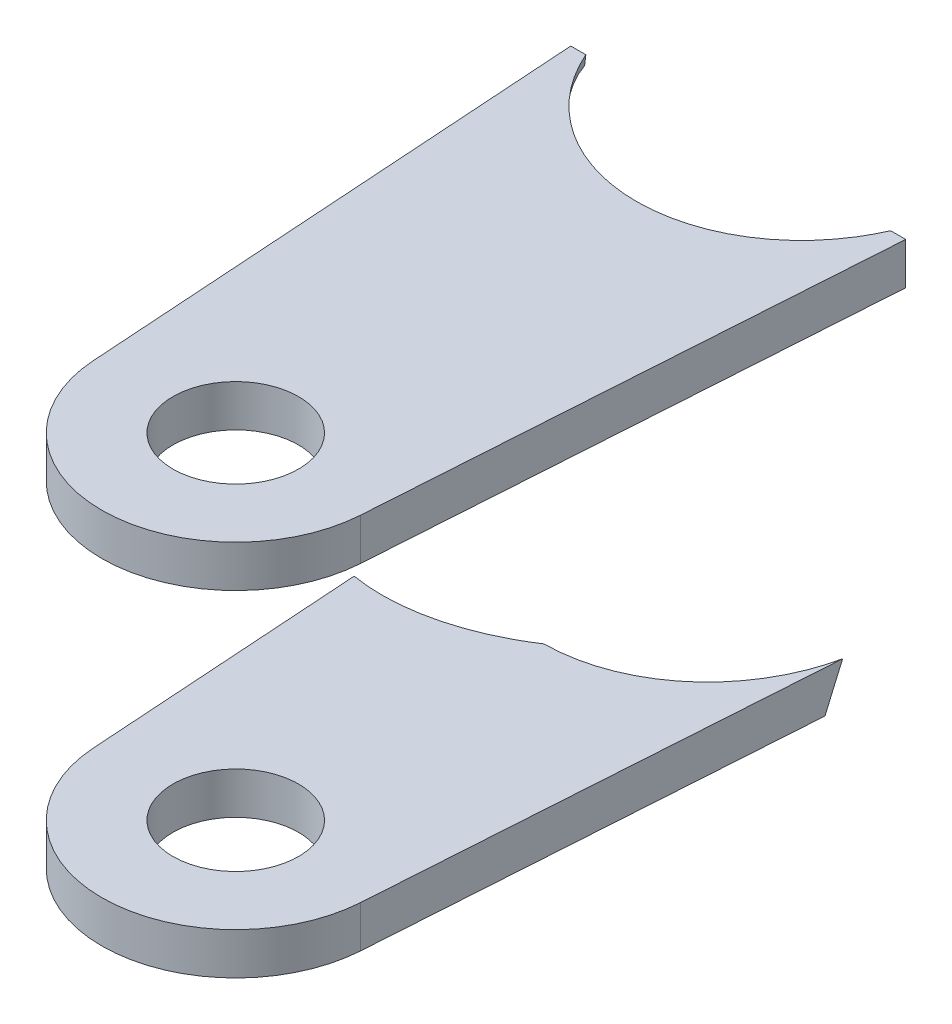
ISO-10303-21;
HEADER;
FILE_DESCRIPTION(('STEP AP214'),'2;1');
FILE_NAME('part.step','',(''),(''),'','','');
FILE_SCHEMA(('AUTOMOTIVE_DESIGN { 1 0 10303 214 1 1 1 1 }'));
ENDSEC;
DATA;
#1=APPLICATION_CONTEXT('core data for automotive mechanical design processes');
#2=APPLICATION_PROTOCOL_DEFINITION('international standard','automotive_design',2000,#1);
#3=PRODUCT_CONTEXT('',#1,'mechanical');
#4=PRODUCT('Part','Part','',(#3));
#5=PRODUCT_RELATED_PRODUCT_CATEGORY('part','',(#4));
#6=PRODUCT_DEFINITION_FORMATION('','',#4);
#7=PRODUCT_DEFINITION_CONTEXT('part definition',#1,'design');
#8=PRODUCT_DEFINITION('design','',#6,#7);
#9=PRODUCT_DEFINITION_SHAPE('','',#8);
#10=(LENGTH_UNIT() NAMED_UNIT(*) SI_UNIT(.MILLI.,.METRE.));
#11=(NAMED_UNIT(*) PLANE_ANGLE_UNIT() SI_UNIT($,.RADIAN.));
#12=(NAMED_UNIT(*) SI_UNIT($,.STERADIAN.) SOLID_ANGLE_UNIT());
#13=UNCERTAINTY_MEASURE_WITH_UNIT(LENGTH_MEASURE(1.E-05),#10,'distance_accuracy_value','');
#14=(GEOMETRIC_REPRESENTATION_CONTEXT(3) GLOBAL_UNCERTAINTY_ASSIGNED_CONTEXT((#13)) GLOBAL_UNIT_ASSIGNED_CONTEXT((#10,
#11,#12)) REPRESENTATION_CONTEXT('',''));
#15=CARTESIAN_POINT('',(0.,0.,0.));
#16=DIRECTION('',(0.,0.,1.));
#17=DIRECTION('',(1.,0.,0.));
#18=AXIS2_PLACEMENT_3D('',#15,#16,#17);
#19=CARTESIAN_POINT('',(0.,-11.13155,0.));
#20=DIRECTION('',(0.,1.,0.));
#21=DIRECTION('',(0.,0.,1.));
#22=AXIS2_PLACEMENT_3D('',#19,#20,#21);
#23=PLANE('',#22);
#24=CARTESIAN_POINT('',(0.,-11.13155,0.));
#25=DIRECTION('',(0.,1.,0.));
#26=DIRECTION('',(0.,0.,1.));
#27=AXIS2_PLACEMENT_3D('',#24,#25,#26);
#28=CIRCLE('',#27,4.7625);
#29=CARTESIAN_POINT('',(0.,-11.13155,4.7625));
#30=VERTEX_POINT('',#29);
#31=EDGE_CURVE('E219',#30,#30,#28,.T.);
#32=ORIENTED_EDGE('',*,*,#31,.F.);
#33=EDGE_LOOP('',(#32));
#34=FACE_BOUND('',#33,.T.);
#35=DIRECTION('',(0.065941170815567,0.,-0.997823512446701));
#36=VECTOR('',#35,1.);
#37=CARTESIAN_POINT('',(10.1378868864585,-11.13155,0.669962295486161));
#38=LINE('',#37,#36);
#39=CARTESIAN_POINT('',(10.1378868864585,-11.13155,0.669962295486162));
#40=VERTEX_POINT('',#39);
#41=CARTESIAN_POINT('',(12.40370088307,-11.13155,-33.6163940534678));
#42=VERTEX_POINT('',#41);
#43=EDGE_CURVE('E214',#40,#42,#38,.T.);
#44=ORIENTED_EDGE('',*,*,#43,.T.);
#45=CARTESIAN_POINT('',(6.83233166149712E-13,-11.13155,-36.4485542746041));
#46=DIRECTION('',(0.,1.,0.));
#47=DIRECTION('',(0.,0.,-1.));
#48=AXIS2_PLACEMENT_3D('',#45,#46,#47);
#49=ELLIPSE('',#48,13.1882595385154,12.7);
#50=CARTESIAN_POINT('',(0.101055690574163,-11.1315499999997,-23.2607122572307));
#51=VERTEX_POINT('',#50);
#52=EDGE_CURVE('E150',#42,#51,#49,.F.);
#53=ORIENTED_EDGE('',*,*,#52,.T.);
#54=CARTESIAN_POINT('',(-6.23102791069439,-11.13155,-34.3499865807654));
#55=DIRECTION('',(0.,1.,0.));
#56=DIRECTION('',(-0.766871698259869,0.,0.641800435032593));
#57=AXIS2_PLACEMENT_3D('',#54,#55,#56);
#58=ELLIPSE('',#57,15.7233905378156,12.7);
#59=CARTESIAN_POINT('',(-11.5378820796358,-11.13155,-20.5148013929212));
#60=VERTEX_POINT('',#59);
#61=EDGE_CURVE('E224',#51,#60,#58,.F.);
#62=ORIENTED_EDGE('',*,*,#61,.T.);
#63=DIRECTION('',(-0.065941170815567,0.,-0.997823512446701));
#64=VECTOR('',#63,1.);
#65=CARTESIAN_POINT('',(-10.1378868864585,-11.13155,0.669962295486161));
#66=LINE('',#65,#64);
#67=CARTESIAN_POINT('',(-10.1378868864585,-11.13155,0.669962295486162));
#68=VERTEX_POINT('',#67);
#69=EDGE_CURVE('E217',#68,#60,#66,.T.);
#70=ORIENTED_EDGE('',*,*,#69,.F.);
#71=CARTESIAN_POINT('',(0.,-11.13155,0.));
#72=DIRECTION('',(0.,1.,0.));
#73=DIRECTION('',(0.,0.,1.));
#74=AXIS2_PLACEMENT_3D('',#71,#72,#73);
#75=CIRCLE('',#74,10.16);
#76=EDGE_CURVE('E221',#68,#40,#75,.T.);
#77=ORIENTED_EDGE('',*,*,#76,.T.);
#78=EDGE_LOOP('',(#44,#53,#62,#70,#77));
#79=FACE_BOUND('',#78,.T.);
#80=ADVANCED_FACE('F146',(#34,#79),#23,.T.);
#81=CARTESIAN_POINT('',(0.,-14.30655,0.));
#82=DIRECTION('',(0.,1.,0.));
#83=DIRECTION('',(0.,0.,1.));
#84=AXIS2_PLACEMENT_3D('',#81,#82,#83);
#85=PLANE('',#84);
#86=CARTESIAN_POINT('',(6.98046871886005E-13,-14.30655,-35.5597281648096));
#87=DIRECTION('',(0.,1.,0.));
#88=DIRECTION('',(0.,0.,-1.));
#89=AXIS2_PLACEMENT_3D('',#86,#87,#88);
#90=ELLIPSE('',#89,13.1882595385154,12.7);
#91=CARTESIAN_POINT('',(12.3207206773152,-14.30655,-32.3607354209967));
#92=VERTEX_POINT('',#91);
#93=CARTESIAN_POINT('',(-0.781268382071083,-14.3065499999997,-22.3964468765122));
#94=VERTEX_POINT('',#93);
#95=EDGE_CURVE('E13',#92,#94,#90,.F.);
#96=ORIENTED_EDGE('',*,*,#95,.F.);
#97=DIRECTION('',(0.065941170815567,0.,-0.997823512446701));
#98=VECTOR('',#97,1.);
#99=CARTESIAN_POINT('',(10.1378868864585,-14.30655,0.669962295486161));
#100=LINE('',#99,#98);
#101=CARTESIAN_POINT('',(10.1378868864585,-14.30655,0.669962295486162));
#102=VERTEX_POINT('',#101);
#103=EDGE_CURVE('E195',#102,#92,#100,.T.);
#104=ORIENTED_EDGE('',*,*,#103,.F.);
#105=CARTESIAN_POINT('',(0.,-14.30655,0.));
#106=DIRECTION('',(0.,1.,0.));
#107=DIRECTION('',(0.,0.,1.));
#108=AXIS2_PLACEMENT_3D('',#105,#106,#107);
#109=CIRCLE('',#108,10.16);
#110=CARTESIAN_POINT('',(-10.1378868864585,-14.30655,0.669962295486162));
#111=VERTEX_POINT('',#110);
#112=EDGE_CURVE('E194',#111,#102,#109,.T.);
#113=ORIENTED_EDGE('',*,*,#112,.F.);
#114=DIRECTION('',(-0.065941170815567,0.,-0.997823512446701));
#115=VECTOR('',#114,1.);
#116=CARTESIAN_POINT('',(-10.1378868864585,-14.30655,0.669962295486161));
#117=LINE('',#116,#115);
#118=CARTESIAN_POINT('',(-11.4274495554684,-14.30655,-18.8437335639729));
#119=VERTEX_POINT('',#118);
#120=EDGE_CURVE('E211',#111,#119,#117,.T.);
#121=ORIENTED_EDGE('',*,*,#120,.T.);
#122=CARTESIAN_POINT('',(-8.00827489035622,-14.30655,-32.8625958121459));
#123=DIRECTION('',(0.,1.,0.));
#124=DIRECTION('',(-0.766871698259869,0.,0.641800435032593));
#125=AXIS2_PLACEMENT_3D('',#122,#123,#124);
#126=ELLIPSE('',#125,15.7233905378156,12.7);
#127=EDGE_CURVE('E204',#94,#119,#126,.F.);
#128=ORIENTED_EDGE('',*,*,#127,.F.);
#129=EDGE_LOOP('',(#96,#104,#113,#121,#128));
#130=FACE_BOUND('',#129,.T.);
#131=CARTESIAN_POINT('',(0.,-14.30655,0.));
#132=DIRECTION('',(0.,1.,0.));
#133=DIRECTION('',(0.,0.,1.));
#134=AXIS2_PLACEMENT_3D('',#131,#132,#133);
#135=CIRCLE('',#134,4.7625);
#136=CARTESIAN_POINT('',(0.,-14.30655,4.7625));
#137=VERTEX_POINT('',#136);
#138=EDGE_CURVE('E208',#137,#137,#135,.T.);
#139=ORIENTED_EDGE('',*,*,#138,.T.);
#140=EDGE_LOOP('',(#139));
#141=FACE_BOUND('',#140,.T.);
#142=ADVANCED_FACE('F200',(#130,#141),#85,.F.);
#143=CARTESIAN_POINT('',(10.1378868864585,-14.30655,0.669962295486161));
#144=DIRECTION('',(0.997823512446701,0.,0.065941170815567));
#145=DIRECTION('',(0.065941170815567,0.,-0.997823512446701));
#146=AXIS2_PLACEMENT_3D('',#143,#144,#145);
#147=PLANE('',#146);
#148=ORIENTED_EDGE('',*,*,#103,.T.);
#149=CARTESIAN_POINT('',(3.85864112484633E-12,-691.712118315301,154.076730430113));
#150=DIRECTION('',(0.997823512446701,0.,0.065941170815567));
#151=DIRECTION('',(0.0177406009551015,0.963129900574879,-0.268451235229746));
#152=AXIS2_PLACEMENT_3D('',#149,#150,#151);
#153=ELLIPSE('',#152,714.426831977597,12.7);
#154=EDGE_CURVE('E188',#92,#42,#153,.F.);
#155=ORIENTED_EDGE('',*,*,#154,.T.);
#156=ORIENTED_EDGE('',*,*,#43,.F.);
#157=DIRECTION('',(0.,1.,0.));
#158=VECTOR('',#157,1.);
#159=CARTESIAN_POINT('',(10.1378868864585,-14.30655,0.669962295486162));
#160=LINE('',#159,#158);
#161=EDGE_CURVE('E206',#102,#40,#160,.T.);
#162=ORIENTED_EDGE('',*,*,#161,.F.);
#163=EDGE_LOOP('',(#148,#155,#156,#162));
#164=FACE_BOUND('',#163,.T.);
#165=ADVANCED_FACE('F205',(#164),#147,.T.);
#166=CARTESIAN_POINT('',(0.,-14.30655,0.));
#167=DIRECTION('',(0.,1.,0.));
#168=DIRECTION('',(0.,0.,1.));
#169=AXIS2_PLACEMENT_3D('',#166,#167,#168);
#170=CYLINDRICAL_SURFACE('',#169,10.16);
#171=ORIENTED_EDGE('',*,*,#76,.F.);
#172=DIRECTION('',(0.,1.,0.));
#173=VECTOR('',#172,1.);
#174=CARTESIAN_POINT('',(-10.1378868864585,-14.30655,0.669962295486162));
#175=LINE('',#174,#173);
#176=EDGE_CURVE('E220',#111,#68,#175,.T.);
#177=ORIENTED_EDGE('',*,*,#176,.F.);
#178=ORIENTED_EDGE('',*,*,#112,.T.);
#179=ORIENTED_EDGE('',*,*,#161,.T.);
#180=EDGE_LOOP('',(#171,#177,#178,#179));
#181=FACE_BOUND('',#180,.T.);
#182=ADVANCED_FACE('F250',(#181),#170,.T.);
#183=CARTESIAN_POINT('',(-10.1378868864585,-14.30655,0.669962295486161));
#184=DIRECTION('',(0.997823512446701,0.,-0.065941170815567));
#185=DIRECTION('',(-0.065941170815567,0.,-0.997823512446701));
#186=AXIS2_PLACEMENT_3D('',#183,#184,#185);
#187=PLANE('',#186);
#188=CARTESIAN_POINT('',(-12.1261393338043,-21.6629949722319,-29.4163254683489));
#189=DIRECTION('',(0.997823512446701,0.,-0.065941170815567));
#190=DIRECTION('',(0.0260761151254162,-0.918489600399509,0.394584452529387));
#191=AXIS2_PLACEMENT_3D('',#188,#189,#190);
#192=ELLIPSE('',#191,26.6753169357552,12.7);
#193=EDGE_CURVE('E156',#119,#60,#192,.F.);
#194=ORIENTED_EDGE('',*,*,#193,.F.);
#195=ORIENTED_EDGE('',*,*,#120,.F.);
#196=ORIENTED_EDGE('',*,*,#176,.T.);
#197=ORIENTED_EDGE('',*,*,#69,.T.);
#198=EDGE_LOOP('',(#194,#195,#196,#197));
#199=FACE_BOUND('',#198,.T.);
#200=ADVANCED_FACE('F248',(#199),#187,.F.);
#201=CARTESIAN_POINT('',(0.,-14.30655,0.));
#202=DIRECTION('',(0.,1.,0.));
#203=DIRECTION('',(0.,0.,1.));
#204=AXIS2_PLACEMENT_3D('',#201,#202,#203);
#205=CYLINDRICAL_SURFACE('',#204,4.7625);
#206=ORIENTED_EDGE('',*,*,#138,.F.);
#207=EDGE_LOOP('',(#206));
#208=FACE_BOUND('',#207,.T.);
#209=ORIENTED_EDGE('',*,*,#31,.T.);
#210=EDGE_LOOP('',(#209));
#211=FACE_BOUND('',#210,.T.);
#212=ADVANCED_FACE('F241',(#208,#211),#205,.F.);
#213=CARTESIAN_POINT('',(0.,0.,-39.5647786155456));
#214=DIRECTION('',(-0.452128178178227,-0.807713830516125,0.378389321321581));
#215=DIRECTION('',(-0.889431307788424,0.440147131441255,-0.123217090575167));
#216=AXIS2_PLACEMENT_3D('',#213,#214,#215);
#217=CYLINDRICAL_SURFACE('',#216,12.7);
#218=CARTESIAN_POINT('',(0.,0.,-39.5647786155457));
#219=DIRECTION('',(-0.922199851791725,0.316689681614929,0.221934852859925));
#220=DIRECTION('',(-0.233178653920448,-0.913208887206712,0.334181453229419));
#221=AXIS2_PLACEMENT_3D('',#218,#219,#220);
#222=ELLIPSE('',#221,51.8080433073034,12.7);
#223=EDGE_CURVE('E162',#51,#94,#222,.F.);
#224=ORIENTED_EDGE('',*,*,#223,.T.);
#225=ORIENTED_EDGE('',*,*,#127,.T.);
#226=ORIENTED_EDGE('',*,*,#193,.T.);
#227=ORIENTED_EDGE('',*,*,#61,.F.);
#228=EDGE_LOOP('',(#224,#225,#226,#227));
#229=FACE_BOUND('',#228,.T.);
#230=ADVANCED_FACE('F245',(#229),#217,.F.);
#231=CARTESIAN_POINT('',(1.65839564303383E-12,-220.136705038398,22.0614422229685));
#232=DIRECTION('',(0.,0.962977712328952,-0.269581018541175));
#233=DIRECTION('',(1.,0.,0.));
#234=AXIS2_PLACEMENT_3D('',#231,#232,#233);
#235=CYLINDRICAL_SURFACE('',#234,12.7);
#236=ORIENTED_EDGE('',*,*,#52,.F.);
#237=ORIENTED_EDGE('',*,*,#154,.F.);
#238=ORIENTED_EDGE('',*,*,#95,.T.);
#239=ORIENTED_EDGE('',*,*,#223,.F.);
#240=EDGE_LOOP('',(#236,#237,#238,#239));
#241=FACE_BOUND('',#240,.T.);
#242=ADVANCED_FACE('F148',(#241),#235,.F.);
#243=CLOSED_SHELL('',(#80,#142,#165,#182,#200,#212,#230,#242));
#244=MANIFOLD_SOLID_BREP('B2',#243);
#245=CARTESIAN_POINT('',(0.,14.30655,-38.1));
#246=DIRECTION('',(0.,0.,-1.));
#247=DIRECTION('',(-1.,0.,0.));
#248=AXIS2_PLACEMENT_3D('',#245,#246,#247);
#249=PLANE('',#248);
#250=DIRECTION('',(1.,0.,0.));
#251=VECTOR('',#250,1.);
#252=CARTESIAN_POINT('',(0.,14.30655,-38.1));
#253=LINE('',#252,#251);
#254=CARTESIAN_POINT('',(-12.7,14.30655,-38.1));
#255=VERTEX_POINT('',#254);
#256=CARTESIAN_POINT('',(-11.5561803095011,14.30655,-38.1));
#257=VERTEX_POINT('',#256);
#258=EDGE_CURVE('E421',#255,#257,#253,.T.);
#259=ORIENTED_EDGE('',*,*,#258,.T.);
#260=CARTESIAN_POINT('',(6.55709187335536E-13,-5.23237566167681,-38.1));
#261=DIRECTION('',(0.,0.,-1.));
#262=DIRECTION('',(0.,1.,0.));
#263=AXIS2_PLACEMENT_3D('',#260,#261,#262);
#264=ELLIPSE('',#263,47.110141762671,12.7);
#265=CARTESIAN_POINT('',(-11.6484647986321,13.5373700891487,-38.1));
#266=VERTEX_POINT('',#265);
#267=EDGE_CURVE('E347',#257,#266,#264,.F.);
#268=ORIENTED_EDGE('',*,*,#267,.T.);
#269=CARTESIAN_POINT('',(-4.69003661605366,0.410057788524692,-38.1));
#270=DIRECTION('',(0.,0.,-1.));
#271=DIRECTION('',(0.996199625093029,-0.0870994085198601,0.));
#272=AXIS2_PLACEMENT_3D('',#269,#270,#271);
#273=ELLIPSE('',#272,42.7489747236034,12.7);
#274=CARTESIAN_POINT('',(-12.7,13.5649950966647,-38.1));
#275=VERTEX_POINT('',#274);
#276=EDGE_CURVE('E374',#266,#275,#273,.F.);
#277=ORIENTED_EDGE('',*,*,#276,.T.);
#278=DIRECTION('',(0.,-1.,0.));
#279=VECTOR('',#278,1.);
#280=CARTESIAN_POINT('',(-12.7,14.30655,-38.1));
#281=LINE('',#280,#279);
#282=EDGE_CURVE('E333',#255,#275,#281,.T.);
#283=ORIENTED_EDGE('',*,*,#282,.F.);
#284=EDGE_LOOP('',(#259,#268,#277,#283));
#285=FACE_BOUND('',#284,.T.);
#286=ADVANCED_FACE('F329',(#285),#249,.T.);
#287=CARTESIAN_POINT('',(0.,11.13155,0.));
#288=DIRECTION('',(0.,1.,0.));
#289=DIRECTION('',(0.,0.,1.));
#290=AXIS2_PLACEMENT_3D('',#287,#288,#289);
#291=PLANE('',#290);
#292=CARTESIAN_POINT('',(5.79359461526828E-13,11.13155,-42.6810029564838));
#293=DIRECTION('',(0.,1.,0.));
#294=DIRECTION('',(0.,0.,-1.));
#295=AXIS2_PLACEMENT_3D('',#292,#293,#294);
#296=ELLIPSE('',#295,13.1882595385154,12.7);
#297=CARTESIAN_POINT('',(11.9092198308345,11.13155,-38.1));
#298=VERTEX_POINT('',#297);
#299=CARTESIAN_POINT('',(-4.90546546785842,11.13155,-30.5162690672273));
#300=VERTEX_POINT('',#299);
#301=EDGE_CURVE('E144',#298,#300,#296,.F.);
#302=ORIENTED_EDGE('',*,*,#301,.F.);
#303=DIRECTION('',(1.,0.,0.));
#304=VECTOR('',#303,1.);
#305=CARTESIAN_POINT('',(0.,11.13155,-38.1));
#306=LINE('',#305,#304);
#307=CARTESIAN_POINT('',(12.7,11.13155,-38.1));
#308=VERTEX_POINT('',#307);
#309=EDGE_CURVE('E418',#298,#308,#306,.T.);
#310=ORIENTED_EDGE('',*,*,#309,.T.);
#311=DIRECTION('',(0.065941170815567,0.,-0.997823512446701));
#312=VECTOR('',#311,1.);
#313=CARTESIAN_POINT('',(10.1378868864585,11.13155,0.669962295486161));
#314=LINE('',#313,#312);
#315=CARTESIAN_POINT('',(10.1378868864585,11.13155,0.669962295486162));
#316=VERTEX_POINT('',#315);
#317=EDGE_CURVE('E388',#316,#308,#314,.T.);
#318=ORIENTED_EDGE('',*,*,#317,.F.);
#319=CARTESIAN_POINT('',(0.,11.13155,0.));
#320=DIRECTION('',(0.,1.,0.));
#321=DIRECTION('',(0.,0.,1.));
#322=AXIS2_PLACEMENT_3D('',#319,#320,#321);
#323=CIRCLE('',#322,10.16);
#324=CARTESIAN_POINT('',(-10.1378868864585,11.13155,0.669962295486162));
#325=VERTEX_POINT('',#324);
#326=EDGE_CURVE('E389',#325,#316,#323,.T.);
#327=ORIENTED_EDGE('',*,*,#326,.F.);
#328=DIRECTION('',(-0.065941170815567,0.,-0.997823512446701));
#329=VECTOR('',#328,1.);
#330=CARTESIAN_POINT('',(-10.1378868864585,11.13155,0.669962295486161));
#331=LINE('',#330,#329);
#332=CARTESIAN_POINT('',(-11.9933469383842,11.13155,-27.406907485843));
#333=VERTEX_POINT('',#332);
#334=EDGE_CURVE('E382',#325,#333,#331,.T.);
#335=ORIENTED_EDGE('',*,*,#334,.T.);
#336=CARTESIAN_POINT('',(-127.317121036198,11.13155,0.198534883615272));
#337=DIRECTION('',(0.,1.,0.));
#338=DIRECTION('',(0.954529669380213,0.,-0.298115934282121));
#339=AXIS2_PLACEMENT_3D('',#336,#337,#338);
#340=ELLIPSE('',#339,152.704779092073,12.7);
#341=EDGE_CURVE('E339',#300,#333,#340,.F.);
#342=ORIENTED_EDGE('',*,*,#341,.F.);
#343=EDGE_LOOP('',(#302,#310,#318,#327,#335,#342));
#344=FACE_BOUND('',#343,.T.);
#345=CARTESIAN_POINT('',(0.,11.13155,0.));
#346=DIRECTION('',(0.,1.,0.));
#347=DIRECTION('',(0.,0.,1.));
#348=AXIS2_PLACEMENT_3D('',#345,#346,#347);
#349=CIRCLE('',#348,4.7625);
#350=CARTESIAN_POINT('',(0.,11.13155,4.7625));
#351=VERTEX_POINT('',#350);
#352=EDGE_CURVE('E398',#351,#351,#349,.T.);
#353=ORIENTED_EDGE('',*,*,#352,.T.);
#354=EDGE_LOOP('',(#353));
#355=FACE_BOUND('',#354,.T.);
#356=ADVANCED_FACE('F378',(#344,#355),#291,.F.);
#357=ORIENTED_EDGE('',*,*,#309,.F.);
#358=CARTESIAN_POINT('',(11.5561803095023,14.30655,-38.1));
#359=VERTEX_POINT('',#358);
#360=EDGE_CURVE('E358',#298,#359,#264,.F.);
#361=ORIENTED_EDGE('',*,*,#360,.T.);
#362=CARTESIAN_POINT('',(12.7,14.30655,-38.1));
#363=VERTEX_POINT('',#362);
#364=EDGE_CURVE('E397',#359,#363,#253,.T.);
#365=ORIENTED_EDGE('',*,*,#364,.T.);
#366=DIRECTION('',(0.,-1.,0.));
#367=VECTOR('',#366,1.);
#368=CARTESIAN_POINT('',(12.7,14.30655,-38.1));
#369=LINE('',#368,#367);
#370=EDGE_CURVE('E394',#363,#308,#369,.T.);
#371=ORIENTED_EDGE('',*,*,#370,.T.);
#372=EDGE_LOOP('',(#357,#361,#365,#371));
#373=FACE_BOUND('',#372,.T.);
#374=ADVANCED_FACE('F434',(#373),#249,.T.);
#375=CARTESIAN_POINT('',(-10.1378868864585,14.30655,0.669962295486161));
#376=DIRECTION('',(-0.997823512446701,0.,0.065941170815567));
#377=DIRECTION('',(0.065941170815567,0.,0.997823512446701));
#378=AXIS2_PLACEMENT_3D('',#375,#376,#377);
#379=PLANE('',#378);
#380=ORIENTED_EDGE('',*,*,#282,.T.);
#381=CARTESIAN_POINT('',(-12.5380216961126,1.09622032194462,-35.6489400912042));
#382=DIRECTION('',(-0.997823512446701,0.,0.065941170815567));
#383=DIRECTION('',(-0.0621249078650128,-0.335258306947819,-0.940075722186913));
#384=AXIS2_PLACEMENT_3D('',#381,#382,#383);
#385=ELLIPSE('',#384,13.1097788473589,12.7);
#386=EDGE_CURVE('E416',#275,#333,#385,.F.);
#387=ORIENTED_EDGE('',*,*,#386,.T.);
#388=ORIENTED_EDGE('',*,*,#334,.F.);
#389=DIRECTION('',(0.,-1.,0.));
#390=VECTOR('',#389,1.);
#391=CARTESIAN_POINT('',(-10.1378868864585,14.30655,0.669962295486162));
#392=LINE('',#391,#390);
#393=CARTESIAN_POINT('',(-10.1378868864585,14.30655,0.669962295486162));
#394=VERTEX_POINT('',#393);
#395=EDGE_CURVE('E385',#394,#325,#392,.T.);
#396=ORIENTED_EDGE('',*,*,#395,.F.);
#397=DIRECTION('',(-0.065941170815567,0.,-0.997823512446701));
#398=VECTOR('',#397,1.);
#399=CARTESIAN_POINT('',(-10.1378868864585,14.30655,0.669962295486161));
#400=LINE('',#399,#398);
#401=EDGE_CURVE('E405',#394,#255,#400,.T.);
#402=ORIENTED_EDGE('',*,*,#401,.T.);
#403=EDGE_LOOP('',(#380,#387,#388,#396,#402));
#404=FACE_BOUND('',#403,.T.);
#405=ADVANCED_FACE('F460',(#404),#379,.T.);
#406=CARTESIAN_POINT('',(0.,14.30655,0.));
#407=DIRECTION('',(0.,-1.,0.));
#408=DIRECTION('',(0.,0.,-1.));
#409=AXIS2_PLACEMENT_3D('',#406,#407,#408);
#410=CYLINDRICAL_SURFACE('',#409,10.16);
#411=ORIENTED_EDGE('',*,*,#326,.T.);
#412=DIRECTION('',(0.,-1.,0.));
#413=VECTOR('',#412,1.);
#414=CARTESIAN_POINT('',(10.1378868864585,14.30655,0.669962295486162));
#415=LINE('',#414,#413);
#416=CARTESIAN_POINT('',(10.1378868864585,14.30655,0.669962295486162));
#417=VERTEX_POINT('',#416);
#418=EDGE_CURVE('E390',#417,#316,#415,.T.);
#419=ORIENTED_EDGE('',*,*,#418,.F.);
#420=CARTESIAN_POINT('',(0.,14.30655,0.));
#421=DIRECTION('',(0.,1.,0.));
#422=DIRECTION('',(0.,0.,1.));
#423=AXIS2_PLACEMENT_3D('',#420,#421,#422);
#424=CIRCLE('',#423,10.16);
#425=EDGE_CURVE('E411',#394,#417,#424,.T.);
#426=ORIENTED_EDGE('',*,*,#425,.F.);
#427=ORIENTED_EDGE('',*,*,#395,.T.);
#428=EDGE_LOOP('',(#411,#419,#426,#427));
#429=FACE_BOUND('',#428,.T.);
#430=ADVANCED_FACE('F446',(#429),#410,.T.);
#431=CARTESIAN_POINT('',(10.1378868864585,14.30655,0.669962295486161));
#432=DIRECTION('',(-0.997823512446701,0.,-0.065941170815567));
#433=DIRECTION('',(-0.065941170815567,0.,0.997823512446701));
#434=AXIS2_PLACEMENT_3D('',#431,#432,#433);
#435=PLANE('',#434);
#436=ORIENTED_EDGE('',*,*,#317,.T.);
#437=ORIENTED_EDGE('',*,*,#370,.F.);
#438=DIRECTION('',(0.065941170815567,0.,-0.997823512446701));
#439=VECTOR('',#438,1.);
#440=CARTESIAN_POINT('',(10.1378868864585,14.30655,0.669962295486161));
#441=LINE('',#440,#439);
#442=EDGE_CURVE('E375',#417,#363,#441,.T.);
#443=ORIENTED_EDGE('',*,*,#442,.F.);
#444=ORIENTED_EDGE('',*,*,#418,.T.);
#445=EDGE_LOOP('',(#436,#437,#443,#444));
#446=FACE_BOUND('',#445,.T.);
#447=ADVANCED_FACE('F438',(#446),#435,.F.);
#448=CARTESIAN_POINT('',(0.,14.30655,0.));
#449=DIRECTION('',(0.,-1.,0.));
#450=DIRECTION('',(0.,0.,-1.));
#451=AXIS2_PLACEMENT_3D('',#448,#449,#450);
#452=CYLINDRICAL_SURFACE('',#451,4.7625);
#453=CARTESIAN_POINT('',(0.,14.30655,0.));
#454=DIRECTION('',(0.,1.,0.));
#455=DIRECTION('',(0.,0.,1.));
#456=AXIS2_PLACEMENT_3D('',#453,#454,#455);
#457=CIRCLE('',#456,4.7625);
#458=CARTESIAN_POINT('',(0.,14.30655,4.7625));
#459=VERTEX_POINT('',#458);
#460=EDGE_CURVE('E393',#459,#459,#457,.T.);
#461=ORIENTED_EDGE('',*,*,#460,.T.);
#462=EDGE_LOOP('',(#461));
#463=FACE_BOUND('',#462,.T.);
#464=ORIENTED_EDGE('',*,*,#352,.F.);
#465=EDGE_LOOP('',(#464));
#466=FACE_BOUND('',#465,.T.);
#467=ADVANCED_FACE('F465',(#463,#466),#452,.F.);
#468=CARTESIAN_POINT('',(0.,14.30655,0.));
#469=DIRECTION('',(0.,1.,0.));
#470=DIRECTION('',(0.,0.,1.));
#471=AXIS2_PLACEMENT_3D('',#468,#469,#470);
#472=PLANE('',#471);
#473=ORIENTED_EDGE('',*,*,#364,.F.);
#474=CARTESIAN_POINT('',(5.64545755790535E-13,14.30655,-43.5698290662784));
#475=DIRECTION('',(0.,1.,0.));
#476=DIRECTION('',(0.,0.,-1.));
#477=AXIS2_PLACEMENT_3D('',#474,#475,#476);
#478=ELLIPSE('',#477,13.1882595385154,12.7);
#479=EDGE_CURVE('E408',#359,#257,#478,.F.);
#480=ORIENTED_EDGE('',*,*,#479,.T.);
#481=ORIENTED_EDGE('',*,*,#258,.F.);
#482=ORIENTED_EDGE('',*,*,#401,.F.);
#483=ORIENTED_EDGE('',*,*,#425,.T.);
#484=ORIENTED_EDGE('',*,*,#442,.T.);
#485=EDGE_LOOP('',(#473,#480,#481,#482,#483,#484));
#486=FACE_BOUND('',#485,.T.);
#487=ORIENTED_EDGE('',*,*,#460,.F.);
#488=EDGE_LOOP('',(#487));
#489=FACE_BOUND('',#488,.T.);
#490=ADVANCED_FACE('F462',(#486,#489),#472,.T.);
#491=CARTESIAN_POINT('',(-117.475,10.2710368064183,-2.87532777581261));
#492=DIRECTION('',(0.951222818948762,-0.0831670107216657,-0.297083148358826));
#493=DIRECTION('',(-0.308504698037437,-0.256431616391803,-0.91600637410638));
#494=AXIS2_PLACEMENT_3D('',#491,#492,#493);
#495=CYLINDRICAL_SURFACE('',#494,12.7);
#496=CARTESIAN_POINT('',(0.,0.,-39.5647786155458));
#497=DIRECTION('',(0.672616105698053,0.622120113267009,-0.400692075070407));
#498=DIRECTION('',(0.672616105698053,-0.739736027771618,-0.0194469424911427));
#499=AXIS2_PLACEMENT_3D('',#496,#497,#498);
#500=ELLIPSE('',#499,17.9605122421383,12.7);
#501=EDGE_CURVE('E361',#266,#300,#500,.T.);
#502=ORIENTED_EDGE('',*,*,#501,.T.);
#503=ORIENTED_EDGE('',*,*,#341,.T.);
#504=ORIENTED_EDGE('',*,*,#386,.F.);
#505=ORIENTED_EDGE('',*,*,#276,.F.);
#506=EDGE_LOOP('',(#502,#503,#504,#505));
#507=FACE_BOUND('',#506,.T.);
#508=ADVANCED_FACE('F369',(#507),#495,.F.);
#509=CARTESIAN_POINT('',(1.65839564303383E-12,-220.136705038398,22.0614422229685));
#510=DIRECTION('',(0.,0.962977712328952,-0.269581018541175));
#511=DIRECTION('',(1.,0.,0.));
#512=AXIS2_PLACEMENT_3D('',#509,#510,#511);
#513=CYLINDRICAL_SURFACE('',#512,12.7);
#514=ORIENTED_EDGE('',*,*,#479,.F.);
#515=ORIENTED_EDGE('',*,*,#360,.F.);
#516=ORIENTED_EDGE('',*,*,#301,.T.);
#517=ORIENTED_EDGE('',*,*,#501,.F.);
#518=ORIENTED_EDGE('',*,*,#267,.F.);
#519=EDGE_LOOP('',(#514,#515,#516,#517,#518));
#520=FACE_BOUND('',#519,.T.);
#521=ADVANCED_FACE('F331',(#520),#513,.F.);
#522=CLOSED_SHELL('',(#286,#356,#374,#405,#430,#447,#467,#490,#508,#521));
#523=MANIFOLD_SOLID_BREP('B7',#522);
#524=ADVANCED_BREP_SHAPE_REPRESENTATION('',(#18,#244,#523),#14);
#525=SHAPE_DEFINITION_REPRESENTATION(#9,#524);
ENDSEC;
END-ISO-10303-21;
